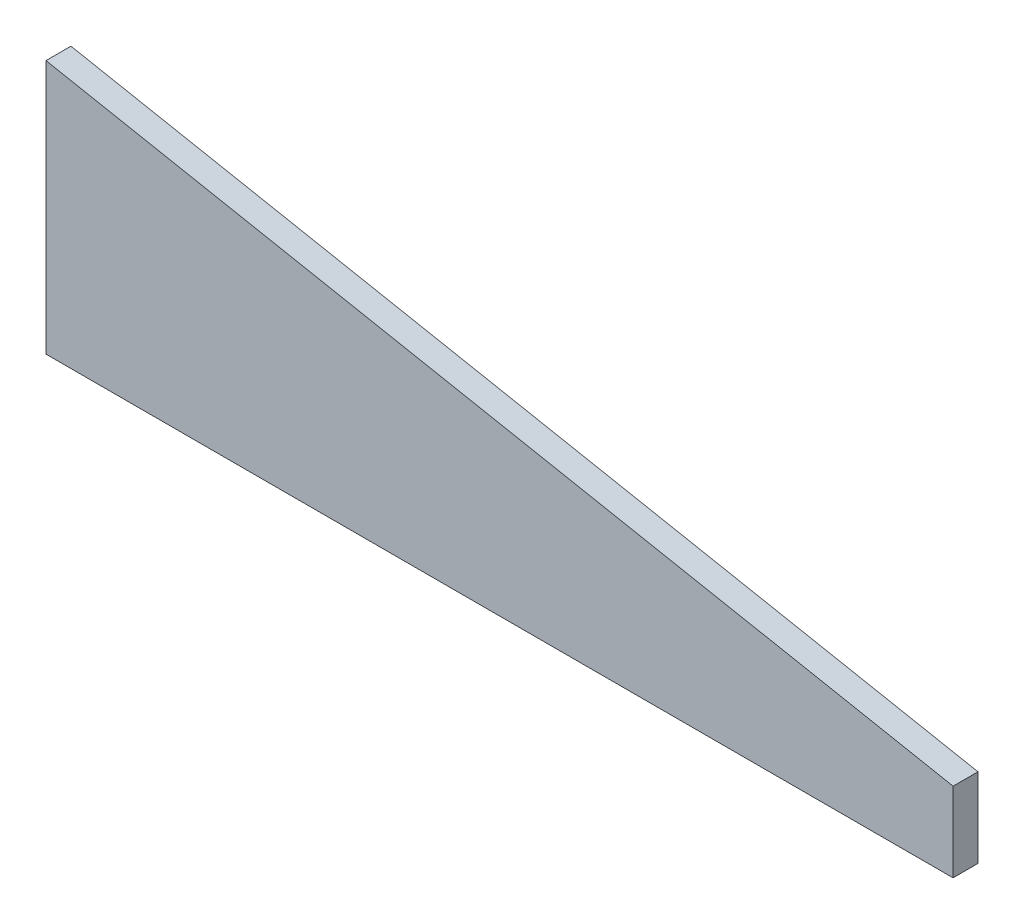
ISO-10303-21;
HEADER;
FILE_DESCRIPTION(('STEP AP214'),'2;1');
FILE_NAME('part.step','',(''),(''),'','','');
FILE_SCHEMA(('AUTOMOTIVE_DESIGN { 1 0 10303 214 1 1 1 1 }'));
ENDSEC;
DATA;
#1=APPLICATION_CONTEXT('core data for automotive mechanical design processes');
#2=APPLICATION_PROTOCOL_DEFINITION('international standard','automotive_design',2000,#1);
#3=PRODUCT_CONTEXT('',#1,'mechanical');
#4=PRODUCT('Part','Part','',(#3));
#5=PRODUCT_RELATED_PRODUCT_CATEGORY('part','',(#4));
#6=PRODUCT_DEFINITION_FORMATION('','',#4);
#7=PRODUCT_DEFINITION_CONTEXT('part definition',#1,'design');
#8=PRODUCT_DEFINITION('design','',#6,#7);
#9=PRODUCT_DEFINITION_SHAPE('','',#8);
#10=(LENGTH_UNIT() NAMED_UNIT(*) SI_UNIT(.MILLI.,.METRE.));
#11=(NAMED_UNIT(*) PLANE_ANGLE_UNIT() SI_UNIT($,.RADIAN.));
#12=(NAMED_UNIT(*) SI_UNIT($,.STERADIAN.) SOLID_ANGLE_UNIT());
#13=UNCERTAINTY_MEASURE_WITH_UNIT(LENGTH_MEASURE(1.E-05),#10,'distance_accuracy_value','');
#14=(GEOMETRIC_REPRESENTATION_CONTEXT(3) GLOBAL_UNCERTAINTY_ASSIGNED_CONTEXT((#13)) GLOBAL_UNIT_ASSIGNED_CONTEXT((#10,
#11,#12)) REPRESENTATION_CONTEXT('',''));
#15=CARTESIAN_POINT('',(0.,0.,0.));
#16=DIRECTION('',(0.,0.,1.));
#17=DIRECTION('',(1.,0.,0.));
#18=AXIS2_PLACEMENT_3D('',#15,#16,#17);
#19=CARTESIAN_POINT('',(778.,70.01,-399.99));
#20=DIRECTION('',(1.,0.,0.));
#21=DIRECTION('',(0.,-1.,0.));
#22=AXIS2_PLACEMENT_3D('',#19,#20,#21);
#23=PLANE('',#22);
#24=DIRECTION('',(0.,-1.,0.));
#25=VECTOR('',#24,1.);
#26=CARTESIAN_POINT('',(778.,112.120822622108,-422.));
#27=LINE('',#26,#25);
#28=CARTESIAN_POINT('',(778.,70.,-422.));
#29=VERTEX_POINT('',#28);
#30=CARTESIAN_POINT('',(778.,0.,-422.));
#31=VERTEX_POINT('',#30);
#32=EDGE_CURVE('E69',#29,#31,#27,.T.);
#33=ORIENTED_EDGE('',*,*,#32,.F.);
#34=DIRECTION('',(0.,0.,-1.));
#35=VECTOR('',#34,1.);
#36=CARTESIAN_POINT('',(778.,70.0000000000001,-411.));
#37=LINE('',#36,#35);
#38=CARTESIAN_POINT('',(778.,70.,-400.));
#39=VERTEX_POINT('',#38);
#40=EDGE_CURVE('E60',#39,#29,#37,.T.);
#41=ORIENTED_EDGE('',*,*,#40,.F.);
#42=DIRECTION('',(0.,1.,0.));
#43=VECTOR('',#42,1.);
#44=CARTESIAN_POINT('',(778.,112.120822622108,-400.));
#45=LINE('',#44,#43);
#46=CARTESIAN_POINT('',(778.,0.,-400.));
#47=VERTEX_POINT('',#46);
#48=EDGE_CURVE('E55',#47,#39,#45,.T.);
#49=ORIENTED_EDGE('',*,*,#48,.F.);
#50=DIRECTION('',(0.,0.,1.));
#51=VECTOR('',#50,1.);
#52=CARTESIAN_POINT('',(778.,0.,-411.));
#53=LINE('',#52,#51);
#54=EDGE_CURVE('E71',#31,#47,#53,.T.);
#55=ORIENTED_EDGE('',*,*,#54,.F.);
#56=EDGE_LOOP('',(#33,#41,#49,#55));
#57=FACE_BOUND('',#56,.T.);
#58=ADVANCED_FACE('F17',(#57),#23,.T.);
#59=CARTESIAN_POINT('',(-22.01,-0.00999999999999446,-400.));
#60=DIRECTION('',(0.,0.,1.));
#61=DIRECTION('',(1.,0.,0.));
#62=AXIS2_PLACEMENT_3D('',#59,#60,#61);
#63=PLANE('',#62);
#64=DIRECTION('',(0.981916313779954,-0.189315484661945,0.));
#65=VECTOR('',#64,1.);
#66=CARTESIAN_POINT('',(378.,147.120822622108,-400.));
#67=LINE('',#66,#65);
#68=CARTESIAN_POINT('',(-22.,224.241645244216,-400.));
#69=VERTEX_POINT('',#68);
#70=EDGE_CURVE('E65',#69,#39,#67,.T.);
#71=ORIENTED_EDGE('',*,*,#70,.F.);
#72=DIRECTION('',(0.,1.,0.));
#73=VECTOR('',#72,1.);
#74=CARTESIAN_POINT('',(-22.,112.120822622108,-400.));
#75=LINE('',#74,#73);
#76=CARTESIAN_POINT('',(-22.,0.,-400.));
#77=VERTEX_POINT('',#76);
#78=EDGE_CURVE('E80',#77,#69,#75,.T.);
#79=ORIENTED_EDGE('',*,*,#78,.F.);
#80=DIRECTION('',(-1.,0.,0.));
#81=VECTOR('',#80,1.);
#82=CARTESIAN_POINT('',(378.,0.,-400.));
#83=LINE('',#82,#81);
#84=EDGE_CURVE('E72',#47,#77,#83,.T.);
#85=ORIENTED_EDGE('',*,*,#84,.F.);
#86=ORIENTED_EDGE('',*,*,#48,.T.);
#87=EDGE_LOOP('',(#71,#79,#85,#86));
#88=FACE_BOUND('',#87,.T.);
#89=ADVANCED_FACE('F91',(#88),#63,.T.);
#90=CARTESIAN_POINT('',(-22.0098191631379,224.243538399063,-399.99));
#91=DIRECTION('',(0.189315484661945,0.981916313779954,0.));
#92=DIRECTION('',(0.981916313779954,-0.189315484661945,0.));
#93=AXIS2_PLACEMENT_3D('',#90,#91,#92);
#94=PLANE('',#93);
#95=DIRECTION('',(0.981916313779954,-0.189315484661945,0.));
#96=VECTOR('',#95,1.);
#97=CARTESIAN_POINT('',(-22.0000000000001,224.241645244216,-422.));
#98=LINE('',#97,#96);
#99=CARTESIAN_POINT('',(-22.,224.241645244216,-422.));
#100=VERTEX_POINT('',#99);
#101=EDGE_CURVE('E21',#100,#29,#98,.T.);
#102=ORIENTED_EDGE('',*,*,#101,.F.);
#103=DIRECTION('',(0.,0.,-1.));
#104=VECTOR('',#103,1.);
#105=CARTESIAN_POINT('',(-22.,224.241645244216,-411.));
#106=LINE('',#105,#104);
#107=EDGE_CURVE('E77',#69,#100,#106,.T.);
#108=ORIENTED_EDGE('',*,*,#107,.F.);
#109=ORIENTED_EDGE('',*,*,#70,.T.);
#110=ORIENTED_EDGE('',*,*,#40,.T.);
#111=EDGE_LOOP('',(#102,#108,#109,#110));
#112=FACE_BOUND('',#111,.T.);
#113=ADVANCED_FACE('F62',(#112),#94,.T.);
#114=CARTESIAN_POINT('',(778.01,-0.00999999999999446,-422.));
#115=DIRECTION('',(0.,0.,-1.));
#116=DIRECTION('',(-1.,0.,0.));
#117=AXIS2_PLACEMENT_3D('',#114,#115,#116);
#118=PLANE('',#117);
#119=ORIENTED_EDGE('',*,*,#101,.T.);
#120=ORIENTED_EDGE('',*,*,#32,.T.);
#121=DIRECTION('',(1.,0.,0.));
#122=VECTOR('',#121,1.);
#123=CARTESIAN_POINT('',(378.,0.,-422.));
#124=LINE('',#123,#122);
#125=CARTESIAN_POINT('',(-22.0000000000001,0.,-422.));
#126=VERTEX_POINT('',#125);
#127=EDGE_CURVE('E36',#126,#31,#124,.T.);
#128=ORIENTED_EDGE('',*,*,#127,.F.);
#129=DIRECTION('',(0.,-1.,0.));
#130=VECTOR('',#129,1.);
#131=CARTESIAN_POINT('',(-22.,112.120822622108,-422.));
#132=LINE('',#131,#130);
#133=EDGE_CURVE('E27',#100,#126,#132,.T.);
#134=ORIENTED_EDGE('',*,*,#133,.F.);
#135=EDGE_LOOP('',(#119,#120,#128,#134));
#136=FACE_BOUND('',#135,.T.);
#137=ADVANCED_FACE('F73',(#136),#118,.T.);
#138=CARTESIAN_POINT('',(778.01,0.,-399.99));
#139=DIRECTION('',(0.,-1.,0.));
#140=DIRECTION('',(-1.,0.,0.));
#141=AXIS2_PLACEMENT_3D('',#138,#139,#140);
#142=PLANE('',#141);
#143=ORIENTED_EDGE('',*,*,#127,.T.);
#144=ORIENTED_EDGE('',*,*,#54,.T.);
#145=ORIENTED_EDGE('',*,*,#84,.T.);
#146=DIRECTION('',(0.,0.,1.));
#147=VECTOR('',#146,1.);
#148=CARTESIAN_POINT('',(-22.,0.,-411.));
#149=LINE('',#148,#147);
#150=EDGE_CURVE('E11',#126,#77,#149,.T.);
#151=ORIENTED_EDGE('',*,*,#150,.F.);
#152=EDGE_LOOP('',(#143,#144,#145,#151));
#153=FACE_BOUND('',#152,.T.);
#154=ADVANCED_FACE('F90',(#153),#142,.T.);
#155=CARTESIAN_POINT('',(-22.,-0.0100000000000122,-399.99));
#156=DIRECTION('',(-1.,0.,0.));
#157=DIRECTION('',(0.,1.,0.));
#158=AXIS2_PLACEMENT_3D('',#155,#156,#157);
#159=PLANE('',#158);
#160=ORIENTED_EDGE('',*,*,#133,.T.);
#161=ORIENTED_EDGE('',*,*,#150,.T.);
#162=ORIENTED_EDGE('',*,*,#78,.T.);
#163=ORIENTED_EDGE('',*,*,#107,.T.);
#164=EDGE_LOOP('',(#160,#161,#162,#163));
#165=FACE_BOUND('',#164,.T.);
#166=ADVANCED_FACE('F19',(#165),#159,.T.);
#167=CLOSED_SHELL('',(#58,#89,#113,#137,#154,#166));
#168=MANIFOLD_SOLID_BREP('B1',#167);
#169=ADVANCED_BREP_SHAPE_REPRESENTATION('',(#18,#168),#14);
#170=SHAPE_DEFINITION_REPRESENTATION(#9,#169);
ENDSEC;
END-ISO-10303-21;
